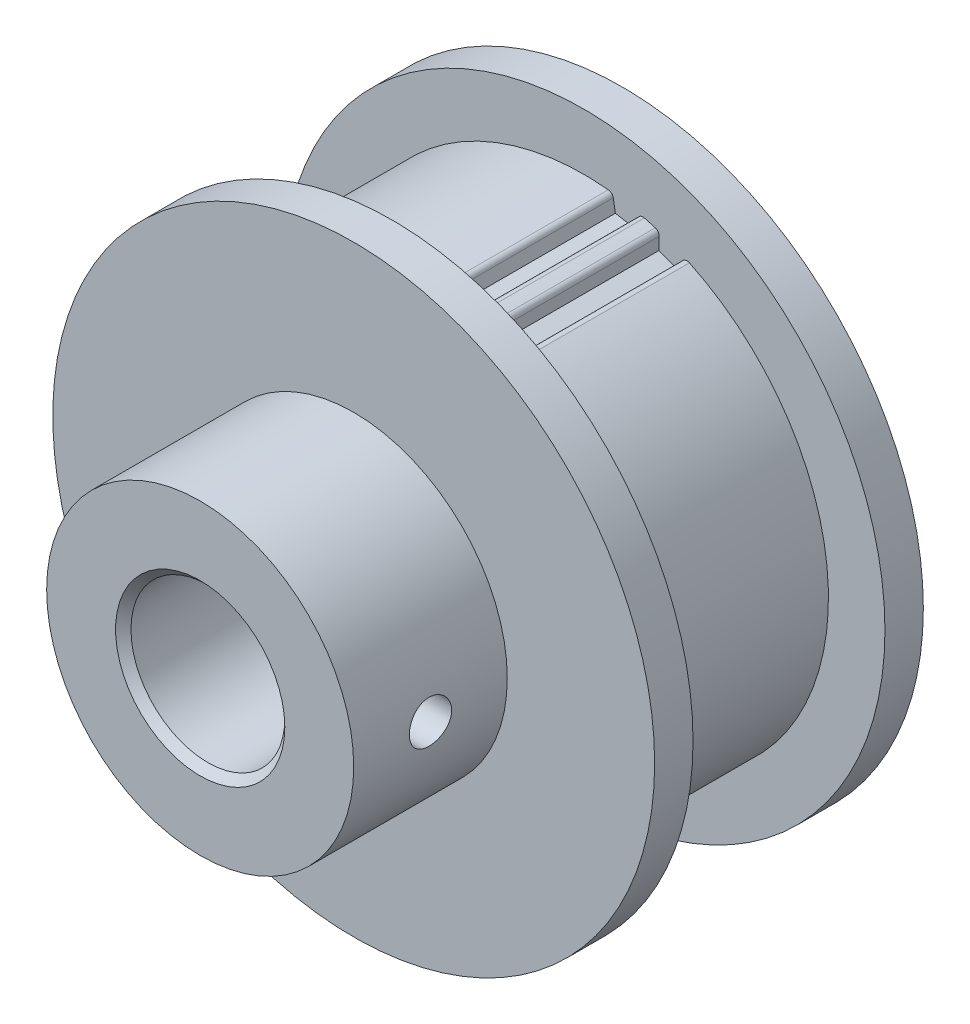
ISO-10303-21;
HEADER;
FILE_DESCRIPTION(('STEP AP214'),'2;1');
FILE_NAME('part.step','',(''),(''),'','','');
FILE_SCHEMA(('AUTOMOTIVE_DESIGN { 1 0 10303 214 1 1 1 1 }'));
ENDSEC;
DATA;
#1=APPLICATION_CONTEXT('core data for automotive mechanical design processes');
#2=APPLICATION_PROTOCOL_DEFINITION('international standard','automotive_design',2000,#1);
#3=PRODUCT_CONTEXT('',#1,'mechanical');
#4=PRODUCT('Part','Part','',(#3));
#5=PRODUCT_RELATED_PRODUCT_CATEGORY('part','',(#4));
#6=PRODUCT_DEFINITION_FORMATION('','',#4);
#7=PRODUCT_DEFINITION_CONTEXT('part definition',#1,'design');
#8=PRODUCT_DEFINITION('design','',#6,#7);
#9=PRODUCT_DEFINITION_SHAPE('','',#8);
#10=(LENGTH_UNIT() NAMED_UNIT(*) SI_UNIT(.MILLI.,.METRE.));
#11=(NAMED_UNIT(*) PLANE_ANGLE_UNIT() SI_UNIT($,.RADIAN.));
#12=(NAMED_UNIT(*) SI_UNIT($,.STERADIAN.) SOLID_ANGLE_UNIT());
#13=UNCERTAINTY_MEASURE_WITH_UNIT(LENGTH_MEASURE(1.E-05),#10,'distance_accuracy_value','');
#14=(GEOMETRIC_REPRESENTATION_CONTEXT(3) GLOBAL_UNCERTAINTY_ASSIGNED_CONTEXT((#13)) GLOBAL_UNIT_ASSIGNED_CONTEXT((#10,
#11,#12)) REPRESENTATION_CONTEXT('',''));
#15=CARTESIAN_POINT('',(0.,0.,0.));
#16=DIRECTION('',(0.,0.,1.));
#17=DIRECTION('',(1.,0.,0.));
#18=AXIS2_PLACEMENT_3D('',#15,#16,#17);
#19=CARTESIAN_POINT('',(0.,0.,11.9062499999245));
#20=DIRECTION('',(0.,0.,1.));
#21=DIRECTION('',(1.,0.,0.));
#22=AXIS2_PLACEMENT_3D('',#19,#20,#21);
#23=CONICAL_SURFACE('',#22,3.49948499996344,0.785398163486787);
#24=CARTESIAN_POINT('',(0.,0.,11.588115));
#25=DIRECTION('',(0.,0.,-1.));
#26=DIRECTION('',(-1.,0.,0.));
#27=AXIS2_PLACEMENT_3D('',#24,#25,#26);
#28=CIRCLE('',#27,3.18135);
#29=CARTESIAN_POINT('',(-3.18135,0.,11.588115));
#30=VERTEX_POINT('',#29);
#31=EDGE_CURVE('E105',#30,#30,#28,.T.);
#32=ORIENTED_EDGE('',*,*,#31,.T.);
#33=EDGE_LOOP('',(#32));
#34=FACE_BOUND('',#33,.T.);
#35=CARTESIAN_POINT('',(0.,0.,11.9062499999814));
#36=DIRECTION('',(0.,0.,1.));
#37=DIRECTION('',(1.,0.,0.));
#38=AXIS2_PLACEMENT_3D('',#35,#36,#37);
#39=CIRCLE('',#38,3.49948500002029);
#40=CARTESIAN_POINT('',(3.49948500002029,0.,11.9062499999814));
#41=VERTEX_POINT('',#40);
#42=EDGE_CURVE('E378',#41,#41,#39,.F.);
#43=ORIENTED_EDGE('',*,*,#42,.F.);
#44=EDGE_LOOP('',(#43));
#45=FACE_BOUND('',#44,.T.);
#46=ADVANCED_FACE('F16',(#34,#45),#23,.F.);
#47=CARTESIAN_POINT('',(0.,0.,-3.96875));
#48=DIRECTION('',(0.,0.,1.));
#49=DIRECTION('',(1.,0.,0.));
#50=AXIS2_PLACEMENT_3D('',#47,#48,#49);
#51=CYLINDRICAL_SURFACE('',#50,10.1092);
#52=CARTESIAN_POINT('',(0.,0.,3.96875));
#53=DIRECTION('',(0.,0.,1.));
#54=DIRECTION('',(1.,0.,0.));
#55=AXIS2_PLACEMENT_3D('',#52,#53,#54);
#56=CIRCLE('',#55,10.1092);
#57=CARTESIAN_POINT('',(2.49571585129707,9.7962914934953,3.96875));
#58=VERTEX_POINT('',#57);
#59=CARTESIAN_POINT('',(2.94843911176593,9.66967587012208,3.96875));
#60=VERTEX_POINT('',#59);
#61=EDGE_CURVE('E90',#58,#60,#56,.F.);
#62=ORIENTED_EDGE('',*,*,#61,.T.);
#63=DIRECTION('',(0.,0.,-1.));
#64=VECTOR('',#63,1.);
#65=CARTESIAN_POINT('',(2.94843911176593,9.66967587012208,-3.96875));
#66=LINE('',#65,#64);
#67=CARTESIAN_POINT('',(2.94843906606155,9.66967588434216,-3.96875));
#68=VERTEX_POINT('',#67);
#69=EDGE_CURVE('E93',#68,#60,#66,.F.);
#70=ORIENTED_EDGE('',*,*,#69,.F.);
#71=CARTESIAN_POINT('',(0.,0.,-3.96875));
#72=DIRECTION('',(0.,0.,1.));
#73=DIRECTION('',(1.,0.,0.));
#74=AXIS2_PLACEMENT_3D('',#71,#72,#73);
#75=CIRCLE('',#74,10.1092);
#76=CARTESIAN_POINT('',(2.49572910728155,9.79628811658046,-3.96875));
#77=VERTEX_POINT('',#76);
#78=EDGE_CURVE('E19',#68,#77,#75,.T.);
#79=ORIENTED_EDGE('',*,*,#78,.T.);
#80=CARTESIAN_POINT('',(2.49571585116245,9.79629149332258,3.96875));
#81=CARTESIAN_POINT('',(2.49571640350494,9.79629135264149,3.63802083333333));
#82=CARTESIAN_POINT('',(2.4957169558469,9.79629121195834,3.30729166666667));
#83=CARTESIAN_POINT('',(2.49571806052977,9.79629093058792,2.64583333333333));
#84=CARTESIAN_POINT('',(2.49571861287068,9.79629078990063,2.31510416666667));
#85=CARTESIAN_POINT('',(2.49571971755144,9.79629050852194,1.65364583333333));
#86=CARTESIAN_POINT('',(2.4957202698913,9.79629036783053,1.32291666666667));
#87=CARTESIAN_POINT('',(2.49572137456996,9.79629008644357,0.661458333333333));
#88=CARTESIAN_POINT('',(2.49572192690876,9.79628994574803,0.330729166666667));
#89=CARTESIAN_POINT('',(2.49572303158532,9.79628966435281,-0.330729166666667));
#90=CARTESIAN_POINT('',(2.49572358392307,9.79628952365314,-0.661458333333333));
#91=CARTESIAN_POINT('',(2.49572468859752,9.79628924224966,-1.32291666666667));
#92=CARTESIAN_POINT('',(2.49572524093421,9.79628910154585,-1.65364583333333));
#93=CARTESIAN_POINT('',(2.49572634560656,9.79628882013411,-2.31510416666667));
#94=CARTESIAN_POINT('',(2.49572689794221,9.79628867942617,-2.64583333333333));
#95=CARTESIAN_POINT('',(2.49572800261245,9.79628839800616,-3.30729166666667));
#96=CARTESIAN_POINT('',(2.49572855494704,9.79628825729409,-3.63802083333333));
#97=CARTESIAN_POINT('',(2.49572910728111,9.79628811657996,-3.96875));
#98=B_SPLINE_CURVE_WITH_KNOTS('',3,(#80,#81,#82,#83,#84,#85,#86,#87,#88,#89,#90,#91,#92,#93,#94,
#95,#96,#97),.UNSPECIFIED.,.F.,.F.,(4,2,2,2,2,2,2,2,4),(0.,0.992187500001473,1.98437500000295,
2.97656250000442,3.96875000000589,4.96093750000737,5.95312500000884,6.94531250001031,
7.93750000001179),.UNSPECIFIED.);
#99=EDGE_CURVE('E117',#58,#77,#98,.T.);
#100=ORIENTED_EDGE('',*,*,#99,.F.);
#101=EDGE_LOOP('',(#62,#70,#79,#100));
#102=FACE_BOUND('',#101,.T.);
#103=ADVANCED_FACE('F94',(#102),#51,.T.);
#104=CARTESIAN_POINT('',(0.,0.,11.90625));
#105=DIRECTION('',(0.,0.,1.));
#106=DIRECTION('',(1.,0.,0.));
#107=AXIS2_PLACEMENT_3D('',#104,#105,#106);
#108=PLANE('',#107);
#109=ORIENTED_EDGE('',*,*,#42,.T.);
#110=EDGE_LOOP('',(#109));
#111=FACE_BOUND('',#110,.T.);
#112=CARTESIAN_POINT('',(0.,0.,11.90625));
#113=DIRECTION('',(0.,0.,1.));
#114=DIRECTION('',(1.,0.,0.));
#115=AXIS2_PLACEMENT_3D('',#112,#113,#114);
#116=CIRCLE('',#115,6.35);
#117=CARTESIAN_POINT('',(6.35,0.,11.90625));
#118=VERTEX_POINT('',#117);
#119=EDGE_CURVE('E97',#118,#118,#116,.F.);
#120=ORIENTED_EDGE('',*,*,#119,.F.);
#121=EDGE_LOOP('',(#120));
#122=FACE_BOUND('',#121,.T.);
#123=ADVANCED_FACE('F383',(#111,#122),#108,.T.);
#124=CARTESIAN_POINT('',(6.35,0.,8.73125));
#125=DIRECTION('',(1.,0.,0.));
#126=DIRECTION('',(0.,0.,-1.));
#127=AXIS2_PLACEMENT_3D('',#124,#125,#126);
#128=CYLINDRICAL_SURFACE('',#127,0.8763);
#129=CARTESIAN_POINT('',(3.18135,0.,7.85495));
#130=CARTESIAN_POINT('',(3.18134841128343,-0.0481893943951872,7.85495254429007));
#131=CARTESIAN_POINT('',(3.18024298845227,-0.0964335547292547,7.85894291922159));
#132=CARTESIAN_POINT('',(3.1759353654732,-0.191573484811042,7.87478331663995));
#133=CARTESIAN_POINT('',(3.17272934101652,-0.238466632063338,7.886647674836));
#134=CARTESIAN_POINT('',(3.16457466220837,-0.329449970853952,7.91781809631712));
#135=CARTESIAN_POINT('',(3.15962928961197,-0.373545257646135,7.93711015166962));
#136=CARTESIAN_POINT('',(3.14851760225123,-0.457859625360473,7.98254420470743));
#137=CARTESIAN_POINT('',(3.14235155403727,-0.498079549672782,8.00868470734763));
#138=CARTESIAN_POINT('',(3.12929072619131,-0.574513195352826,8.06775877064851));
#139=CARTESIAN_POINT('',(3.12238278346796,-0.61061784951194,8.1008305529729));
#140=CARTESIAN_POINT('',(3.1086994626396,-0.676846842823859,8.17253470856861));
#141=CARTESIAN_POINT('',(3.10192411036523,-0.706970026947473,8.21116815332408));
#142=CARTESIAN_POINT('',(3.08913865023835,-0.760917411740671,8.29377557553412));
#143=CARTESIAN_POINT('',(3.08314497886407,-0.784615059156057,8.33783497873882));
#144=CARTESIAN_POINT('',(3.07279466027877,-0.824222549668575,8.42950438590107));
#145=CARTESIAN_POINT('',(3.06843767702725,-0.840133991612145,8.47711365860032));
#146=CARTESIAN_POINT('',(3.06198946318021,-0.86333728324876,8.57332587965073));
#147=CARTESIAN_POINT('',(3.05984641038301,-0.870826661539665,8.62187763053884));
#148=CARTESIAN_POINT('',(3.05791403428716,-0.877589320778472,8.71959215350185));
#149=CARTESIAN_POINT('',(3.05812424135696,-0.876864241055676,8.76875480170605));
#150=CARTESIAN_POINT('',(3.06082836184337,-0.86737498103517,8.86473753553722));
#151=CARTESIAN_POINT('',(3.06325376749431,-0.85885194837192,8.91158370224317));
#152=CARTESIAN_POINT('',(3.07000504534929,-0.834395708839866,9.00315421241168));
#153=CARTESIAN_POINT('',(3.07433108991607,-0.818461829897933,9.04787836302787));
#154=CARTESIAN_POINT('',(3.08445515923665,-0.779444059813929,9.13455486799616));
#155=CARTESIAN_POINT('',(3.09027014540672,-0.756277055716914,9.17646774346375));
#156=CARTESIAN_POINT('',(3.10270754980193,-0.703510106023451,9.25589214469865));
#157=CARTESIAN_POINT('',(3.10933008550084,-0.673909224003207,9.29340302854957));
#158=CARTESIAN_POINT('',(3.12291891433506,-0.607896089575789,9.36433109630335));
#159=CARTESIAN_POINT('',(3.12988915724795,-0.571282941371303,9.39756080407239));
#160=CARTESIAN_POINT('',(3.14318526025427,-0.492901554098854,9.45746141098996));
#161=CARTESIAN_POINT('',(3.1495108435139,-0.451131117240939,9.48412949930078));
#162=CARTESIAN_POINT('',(3.1608491773403,-0.363305959994821,9.53024004910479));
#163=CARTESIAN_POINT('',(3.16585434053572,-0.317228455148669,9.54964100882948));
#164=CARTESIAN_POINT('',(3.1739253063138,-0.222350425059078,9.58033055719853));
#165=CARTESIAN_POINT('',(3.17699512787984,-0.173555773330067,9.59163596397015));
#166=CARTESIAN_POINT('',(3.17972928272051,-0.103619486643986,9.60165092825382));
#167=CARTESIAN_POINT('',(3.18033546992572,-0.082965325340154,9.60386078577132));
#168=CARTESIAN_POINT('',(3.18114617161247,-0.0415441698215397,9.60681087216581));
#169=CARTESIAN_POINT('',(3.18135068498563,-0.0207771752955611,9.60755109698746));
#170=CARTESIAN_POINT('',(3.18134841128344,0.0481893943951852,9.60754745570995));
#171=CARTESIAN_POINT('',(3.18024298845228,0.0964335547292525,9.60355708077842));
#172=CARTESIAN_POINT('',(3.1759353654732,0.19157348481104,9.58771668336004));
#173=CARTESIAN_POINT('',(3.17272934101652,0.238466632063337,9.57585232516399));
#174=CARTESIAN_POINT('',(3.16457466220837,0.329449970853952,9.54468190368288));
#175=CARTESIAN_POINT('',(3.15962928961197,0.373545257646137,9.52538984833038));
#176=CARTESIAN_POINT('',(3.14851760225123,0.457859625360475,9.47995579529257));
#177=CARTESIAN_POINT('',(3.14235155403726,0.498079549672783,9.45381529265236));
#178=CARTESIAN_POINT('',(3.12929072619131,0.574513195352827,9.39474122935149));
#179=CARTESIAN_POINT('',(3.12238278346796,0.610617849511941,9.3616694470271));
#180=CARTESIAN_POINT('',(3.1086994626396,0.676846842823859,9.28996529143139));
#181=CARTESIAN_POINT('',(3.10192411036523,0.706970026947474,9.25133184667592));
#182=CARTESIAN_POINT('',(3.08913865023835,0.760917411740671,9.16872442446587));
#183=CARTESIAN_POINT('',(3.08314497886407,0.784615059156057,9.12466502126118));
#184=CARTESIAN_POINT('',(3.07279466027877,0.824222549668575,9.03299561409893));
#185=CARTESIAN_POINT('',(3.06843767702726,0.840133991612145,8.98538634139967));
#186=CARTESIAN_POINT('',(3.06198946318021,0.86333728324876,8.88917412034927));
#187=CARTESIAN_POINT('',(3.05984641038301,0.870826661539664,8.84062236946116));
#188=CARTESIAN_POINT('',(3.05791403428716,0.877589320778472,8.74290784649815));
#189=CARTESIAN_POINT('',(3.05812424135696,0.876864241055676,8.69374519829395));
#190=CARTESIAN_POINT('',(3.06082836184337,0.86737498103517,8.59776246446278));
#191=CARTESIAN_POINT('',(3.06325376749431,0.85885194837192,8.55091629775683));
#192=CARTESIAN_POINT('',(3.07000504534929,0.834395708839866,8.45934578758832));
#193=CARTESIAN_POINT('',(3.07433108991607,0.818461829897932,8.41462163697213));
#194=CARTESIAN_POINT('',(3.08445515923665,0.779444059813928,8.32794513200383));
#195=CARTESIAN_POINT('',(3.09027014540672,0.756277055716914,8.28603225653625));
#196=CARTESIAN_POINT('',(3.10270754980193,0.70351010602345,8.20660785530134));
#197=CARTESIAN_POINT('',(3.10933008550084,0.673909224003205,8.16909697145043));
#198=CARTESIAN_POINT('',(3.12291891433506,0.607896089575788,8.09816890369665));
#199=CARTESIAN_POINT('',(3.12988915724795,0.571282941371302,8.06493919592761));
#200=CARTESIAN_POINT('',(3.14318526025427,0.492901554098853,8.00503858901004));
#201=CARTESIAN_POINT('',(3.1495108435139,0.451131117240938,7.97837050069922));
#202=CARTESIAN_POINT('',(3.1608491773403,0.36330595999482,7.93225995089521));
#203=CARTESIAN_POINT('',(3.16585434053572,0.317228455148667,7.91285899117052));
#204=CARTESIAN_POINT('',(3.1739253063138,0.222350425059076,7.88216944280147));
#205=CARTESIAN_POINT('',(3.17699512787984,0.173555773330065,7.87086403602985));
#206=CARTESIAN_POINT('',(3.17972928272051,0.103619486643985,7.86084907174617));
#207=CARTESIAN_POINT('',(3.18033546992572,0.0829653253401535,7.85863921422867));
#208=CARTESIAN_POINT('',(3.18114617161247,0.0415441698215389,7.85568912783419));
#209=CARTESIAN_POINT('',(3.18135068498563,0.0207771752955599,7.85494890301255));
#210=CARTESIAN_POINT('',(3.18135,0.,7.85495));
#211=B_SPLINE_CURVE_WITH_KNOTS('',3,(#129,#130,#131,#132,#133,#134,#135,#136,#137,#138,#139,
#140,#141,#142,#143,#144,#145,#146,#147,#148,#149,#150,#151,#152,#153,#154,#155,#156,#157,#158,
#159,#160,#161,#162,#163,#164,#165,#166,#167,#168,#169,#170,#171,#172,#173,#174,#175,#176,#177,
#178,#179,#180,#181,#182,#183,#184,#185,#186,#187,#188,#189,#190,#191,#192,#193,#194,#195,#196,
#197,#198,#199,#200,#201,#202,#203,#204,#205,#206,#207,#208,#209,#210),.UNSPECIFIED.,.T.,.F.,(4,
2,2,2,2,2,2,2,2,2,2,2,2,2,2,2,2,2,2,2,2,2,2,2,2,2,2,2,2,2,2,2,2,2,2,2,2,2,2,2,4),(0.,
0.144488377736948,0.289240541482826,0.433721043074943,0.578170030204596,0.725833451323394,
0.873525358759691,1.02394383604916,1.17433141291198,1.32111306899122,1.46786543290902,
1.61022753532876,1.75260255076833,1.8966778057285,2.04077404429288,2.18987597815134,
2.33904167287127,2.48904669860112,2.63873918472978,2.7010361300674,2.76333324730844,
2.90782162504539,3.05257378879127,3.19705429038339,3.34150327751304,3.48916669863184,
3.63685860606813,3.78727708335761,3.93766466022042,4.08444631629966,4.23119868021747,
4.3735607826372,4.51593579807677,4.66001105303695,4.80410729160133,4.95320922545979,
5.10237492017971,5.25237994590956,5.40207243203823,5.46436937737585,5.52666649461689),.UNSPECIFIED.);
#212=CARTESIAN_POINT('',(3.18135,0.,7.85495));
#213=VERTEX_POINT('',#212);
#214=EDGE_CURVE('E110',#213,#213,#211,.T.);
#215=ORIENTED_EDGE('',*,*,#214,.T.);
#216=EDGE_LOOP('',(#215));
#217=FACE_BOUND('',#216,.T.);
#218=CARTESIAN_POINT('',(6.35,0.,9.60755));
#219=CARTESIAN_POINT('',(6.34999882187669,0.0489415771597092,9.60754616320811));
#220=CARTESIAN_POINT('',(6.34942800821972,0.0979213332346681,9.60343477331248));
#221=CARTESIAN_POINT('',(6.34720354966283,0.194563062898023,9.58708711980179));
#222=CARTESIAN_POINT('',(6.34554766851812,0.242222102701271,9.57483407610127));
#223=CARTESIAN_POINT('',(6.34133982788259,0.334740336646979,9.54257411145077));
#224=CARTESIAN_POINT('',(6.33878887138616,0.379602598779894,9.52257586694625));
#225=CARTESIAN_POINT('',(6.33307420782727,0.465315207568056,9.47541124154906));
#226=CARTESIAN_POINT('',(6.32991074815052,0.506167163952205,9.44824775304814));
#227=CARTESIAN_POINT('',(6.32329924345527,0.582996272424449,9.38732538917262));
#228=CARTESIAN_POINT('',(6.31984959320628,0.618942452363305,9.35352762428492));
#229=CARTESIAN_POINT('',(6.31306712422079,0.684673754170098,9.28037817479168));
#230=CARTESIAN_POINT('',(6.3097343177217,0.714458232295754,9.24102591060299));
#231=CARTESIAN_POINT('',(6.3035477527944,0.767133966387388,9.15768525998461));
#232=CARTESIAN_POINT('',(6.30069602295117,0.789996340177399,9.11367845489106));
#233=CARTESIAN_POINT('',(6.29581567258008,0.82799411313821,9.02240424456906));
#234=CARTESIAN_POINT('',(6.29378700692697,0.843129935936009,8.97513701826248));
#235=CARTESIAN_POINT('',(6.2907977696625,0.865151653714141,8.87900167927929));
#236=CARTESIAN_POINT('',(6.2898304942145,0.872089350471169,8.83014564500724));
#237=CARTESIAN_POINT('',(6.28905313306064,0.877678261954059,8.73195386567757));
#238=CARTESIAN_POINT('',(6.28924299293673,0.876329866360268,8.68261814328778));
#239=CARTESIAN_POINT('',(6.29075231412336,0.865427317998414,8.58523143751886));
#240=CARTESIAN_POINT('',(6.29206386687331,0.855930613835058,8.53717388259181));
#241=CARTESIAN_POINT('',(6.29565646998516,0.829090669134637,8.44334060315377));
#242=CARTESIAN_POINT('',(6.29793755226146,0.811747170300142,8.39756495381265));
#243=CARTESIAN_POINT('',(6.30322113786918,0.769644512986987,8.30941725547737));
#244=CARTESIAN_POINT('',(6.30622605628008,0.744860459430527,8.26705724800358));
#245=CARTESIAN_POINT('',(6.31261662239552,0.688600197305214,8.18707907475268));
#246=CARTESIAN_POINT('',(6.31600226089223,0.657124150567819,8.14946079434215));
#247=CARTESIAN_POINT('',(6.32280742533891,0.588062483295033,8.0797034161643));
#248=CARTESIAN_POINT('',(6.32622700021573,0.550428547876647,8.04761214014584));
#249=CARTESIAN_POINT('',(6.33269028078134,0.470263996513727,7.99017964767082));
#250=CARTESIAN_POINT('',(6.33573381522638,0.427731166589357,7.96484150046508));
#251=CARTESIAN_POINT('',(6.34110506828362,0.338921247244961,7.92163475503292));
#252=CARTESIAN_POINT('',(6.34343187613631,0.292639487477982,7.9037756503118));
#253=CARTESIAN_POINT('',(6.34709601387838,0.197770461568279,7.87613560941537));
#254=CARTESIAN_POINT('',(6.34843543534113,0.149188302186464,7.86633759235411));
#255=CARTESIAN_POINT('',(6.3497352523519,0.0669155657182631,7.85686542506523));
#256=CARTESIAN_POINT('',(6.35000080561176,0.0334667089989035,7.85494737636576));
#257=CARTESIAN_POINT('',(6.34999882187669,-0.0489415771597097,7.85495383679188));
#258=CARTESIAN_POINT('',(6.34942800821972,-0.0979213332346686,7.85906522668752));
#259=CARTESIAN_POINT('',(6.34720354966283,-0.194563062898024,7.87541288019821));
#260=CARTESIAN_POINT('',(6.34554766851812,-0.242222102701271,7.88766592389873));
#261=CARTESIAN_POINT('',(6.34133982788259,-0.33474033664698,7.91992588854923));
#262=CARTESIAN_POINT('',(6.33878887138616,-0.379602598779895,7.93992413305375));
#263=CARTESIAN_POINT('',(6.33307420782727,-0.465315207568056,7.98708875845094));
#264=CARTESIAN_POINT('',(6.32991074815052,-0.506167163952205,8.01425224695186));
#265=CARTESIAN_POINT('',(6.32329924345527,-0.58299627242445,8.07517461082737));
#266=CARTESIAN_POINT('',(6.31984959320628,-0.618942452363306,8.10897237571508));
#267=CARTESIAN_POINT('',(6.31306712422079,-0.684673754170099,8.18212182520832));
#268=CARTESIAN_POINT('',(6.3097343177217,-0.714458232295755,8.22147408939701));
#269=CARTESIAN_POINT('',(6.3035477527944,-0.767133966387389,8.30481474001539));
#270=CARTESIAN_POINT('',(6.30069602295117,-0.7899963401774,8.34882154510894));
#271=CARTESIAN_POINT('',(6.29581567258008,-0.827994113138211,8.44009575543095));
#272=CARTESIAN_POINT('',(6.29378700692697,-0.84312993593601,8.48736298173752));
#273=CARTESIAN_POINT('',(6.2907977696625,-0.865151653714142,8.58349832072071));
#274=CARTESIAN_POINT('',(6.2898304942145,-0.872089350471169,8.63235435499276));
#275=CARTESIAN_POINT('',(6.28905313306064,-0.877678261954059,8.73054613432243));
#276=CARTESIAN_POINT('',(6.28924299293673,-0.876329866360268,8.77988185671222));
#277=CARTESIAN_POINT('',(6.29075231412336,-0.865427317998414,8.87726856248114));
#278=CARTESIAN_POINT('',(6.29206386687331,-0.855930613835058,8.9253261174082));
#279=CARTESIAN_POINT('',(6.29565646998516,-0.829090669134636,9.01915939684623));
#280=CARTESIAN_POINT('',(6.29793755226146,-0.811747170300141,9.06493504618735));
#281=CARTESIAN_POINT('',(6.30322113786918,-0.769644512986986,9.15308274452263));
#282=CARTESIAN_POINT('',(6.30622605628008,-0.744860459430526,9.19544275199642));
#283=CARTESIAN_POINT('',(6.31261662239552,-0.688600197305213,9.27542092524732));
#284=CARTESIAN_POINT('',(6.31600226089223,-0.657124150567818,9.31303920565785));
#285=CARTESIAN_POINT('',(6.32280742533891,-0.588062483295033,9.3827965838357));
#286=CARTESIAN_POINT('',(6.32622700021573,-0.550428547876646,9.41488785985415));
#287=CARTESIAN_POINT('',(6.33269028078134,-0.470263996513726,9.47232035232918));
#288=CARTESIAN_POINT('',(6.33573381522638,-0.427731166589355,9.49765849953491));
#289=CARTESIAN_POINT('',(6.34110506828362,-0.338921247244959,9.54086524496708));
#290=CARTESIAN_POINT('',(6.34343187613631,-0.29263948747798,9.5587243496882));
#291=CARTESIAN_POINT('',(6.34709601387838,-0.197770461568278,9.58636439058463));
#292=CARTESIAN_POINT('',(6.34843543534113,-0.149188302186463,9.59616240764589));
#293=CARTESIAN_POINT('',(6.3497352523519,-0.0669155657182629,9.60563457493477));
#294=CARTESIAN_POINT('',(6.35000080561176,-0.0334667089989036,9.60755262363424));
#295=CARTESIAN_POINT('',(6.35,0.,9.60755));
#296=B_SPLINE_CURVE_WITH_KNOTS('',3,(#218,#219,#220,#221,#222,#223,#224,#225,#226,#227,#228,
#229,#230,#231,#232,#233,#234,#235,#236,#237,#238,#239,#240,#241,#242,#243,#244,#245,#246,#247,
#248,#249,#250,#251,#252,#253,#254,#255,#256,#257,#258,#259,#260,#261,#262,#263,#264,#265,#266,
#267,#268,#269,#270,#271,#272,#273,#274,#275,#276,#277,#278,#279,#280,#281,#282,#283,#284,#285,
#286,#287,#288,#289,#290,#291,#292,#293,#294,#295),.UNSPECIFIED.,.T.,.F.,(4,2,2,2,2,2,2,2,2,2,2,
2,2,2,2,2,2,2,2,2,2,2,2,2,2,2,2,2,2,2,2,2,2,2,2,2,2,2,4),(0.,0.146716851837857,
0.293737031419066,0.440592988012612,0.58738975378788,0.735074210720014,0.882774089166177,
1.03108200544478,1.17938178950668,1.32673940891228,1.47409009840129,1.62041036800368,
1.76673545446456,1.91355568685095,2.06037236910965,2.20840168725813,2.35649816943142,
2.50478207187605,2.65275095584434,2.75307731373161,2.89979416556947,3.04681434515068,
3.19367030174423,3.34046706751949,3.48815152445163,3.63585140289779,3.7841593191764,
3.9324591032383,4.07981672264389,4.2271674121329,4.37348768173529,4.51981276819618,
4.66663300058257,4.81344968284126,4.96147900098974,5.10957548316304,5.25785938560767,
5.40582826957595,5.50615462746323),.UNSPECIFIED.);
#297=CARTESIAN_POINT('',(6.35,0.,9.60755));
#298=VERTEX_POINT('',#297);
#299=EDGE_CURVE('E188',#298,#298,#296,.T.);
#300=ORIENTED_EDGE('',*,*,#299,.F.);
#301=EDGE_LOOP('',(#300));
#302=FACE_BOUND('',#301,.T.);
#303=ADVANCED_FACE('F120',(#217,#302),#128,.F.);
#304=CARTESIAN_POINT('',(2.43929302194116,9.57476401344104,-3.96875));
#305=DIRECTION('',(0.,0.,-1.));
#306=DIRECTION('',(-1.,0.,0.));
#307=AXIS2_PLACEMENT_3D('',#304,#305,#306);
#308=CYLINDRICAL_SURFACE('',#307,0.2286);
#309=CARTESIAN_POINT('',(2.43929302194116,9.57476401344104,3.96875));
#310=DIRECTION('',(0.,0.,-1.));
#311=DIRECTION('',(-1.,0.,0.));
#312=AXIS2_PLACEMENT_3D('',#309,#310,#311);
#313=CIRCLE('',#312,0.2286);
#314=CARTESIAN_POINT('',(2.24131961463603,9.68906401344104,3.96875));
#315=VERTEX_POINT('',#314);
#316=EDGE_CURVE('E118',#315,#58,#313,.T.);
#317=ORIENTED_EDGE('',*,*,#316,.T.);
#318=ORIENTED_EDGE('',*,*,#99,.T.);
#319=CARTESIAN_POINT('',(2.43929302194116,9.57476401344104,-3.96875));
#320=DIRECTION('',(0.,0.,-1.));
#321=DIRECTION('',(-1.,0.,0.));
#322=AXIS2_PLACEMENT_3D('',#319,#320,#321);
#323=CIRCLE('',#322,0.2286);
#324=CARTESIAN_POINT('',(2.24131961463603,9.68906401344104,-3.96875));
#325=VERTEX_POINT('',#324);
#326=EDGE_CURVE('E86',#77,#325,#323,.F.);
#327=ORIENTED_EDGE('',*,*,#326,.T.);
#328=DIRECTION('',(0.,0.,1.));
#329=VECTOR('',#328,1.);
#330=CARTESIAN_POINT('',(2.24131961463603,9.68906401344104,-3.96875));
#331=LINE('',#330,#329);
#332=EDGE_CURVE('E334',#325,#315,#331,.T.);
#333=ORIENTED_EDGE('',*,*,#332,.T.);
#334=EDGE_LOOP('',(#317,#318,#327,#333));
#335=FACE_BOUND('',#334,.T.);
#336=ADVANCED_FACE('F128',(#335),#308,.T.);
#337=CARTESIAN_POINT('',(0.,0.,11.90625));
#338=DIRECTION('',(0.,0.,-1.));
#339=DIRECTION('',(-1.,0.,0.));
#340=AXIS2_PLACEMENT_3D('',#337,#338,#339);
#341=CYLINDRICAL_SURFACE('',#340,3.18135);
#342=ORIENTED_EDGE('',*,*,#31,.F.);
#343=EDGE_LOOP('',(#342));
#344=FACE_BOUND('',#343,.T.);
#345=CARTESIAN_POINT('',(0.,0.,-5.23811499999738));
#346=DIRECTION('',(0.,0.,-1.));
#347=DIRECTION('',(-1.,0.,0.));
#348=AXIS2_PLACEMENT_3D('',#345,#346,#347);
#349=CIRCLE('',#348,3.1813499999771);
#350=CARTESIAN_POINT('',(-3.1813499999771,0.,-5.23811499999738));
#351=VERTEX_POINT('',#350);
#352=EDGE_CURVE('E324',#351,#351,#349,.T.);
#353=ORIENTED_EDGE('',*,*,#352,.T.);
#354=EDGE_LOOP('',(#353));
#355=FACE_BOUND('',#354,.T.);
#356=ORIENTED_EDGE('',*,*,#214,.F.);
#357=EDGE_LOOP('',(#356));
#358=FACE_BOUND('',#357,.T.);
#359=ADVANCED_FACE('F124',(#344,#355,#358),#341,.F.);
#360=CARTESIAN_POINT('',(2.8817509628645,9.4510194025843,-3.96875));
#361=DIRECTION('',(0.,0.,-1.));
#362=DIRECTION('',(-1.,0.,0.));
#363=AXIS2_PLACEMENT_3D('',#360,#361,#362);
#364=CYLINDRICAL_SURFACE('',#363,0.2286);
#365=CARTESIAN_POINT('',(2.8817509628645,9.4510194025843,-3.96875));
#366=DIRECTION('',(0.,0.,-1.));
#367=DIRECTION('',(-1.,0.,0.));
#368=AXIS2_PLACEMENT_3D('',#365,#366,#367);
#369=CIRCLE('',#368,0.2286);
#370=CARTESIAN_POINT('',(3.110296562255,9.44603251986553,-3.96875));
#371=VERTEX_POINT('',#370);
#372=EDGE_CURVE('E83',#371,#68,#369,.F.);
#373=ORIENTED_EDGE('',*,*,#372,.T.);
#374=ORIENTED_EDGE('',*,*,#69,.T.);
#375=CARTESIAN_POINT('',(2.8817509628645,9.4510194025843,3.96875));
#376=DIRECTION('',(0.,0.,-1.));
#377=DIRECTION('',(-1.,0.,0.));
#378=AXIS2_PLACEMENT_3D('',#375,#376,#377);
#379=CIRCLE('',#378,0.2286);
#380=CARTESIAN_POINT('',(3.110296562255,9.44603251986553,3.96875));
#381=VERTEX_POINT('',#380);
#382=EDGE_CURVE('E103',#60,#381,#379,.T.);
#383=ORIENTED_EDGE('',*,*,#382,.T.);
#384=DIRECTION('',(0.,0.,1.));
#385=VECTOR('',#384,1.);
#386=CARTESIAN_POINT('',(3.110296562255,9.44603251986567,-3.96875));
#387=LINE('',#386,#385);
#388=EDGE_CURVE('E101',#381,#371,#387,.F.);
#389=ORIENTED_EDGE('',*,*,#388,.T.);
#390=EDGE_LOOP('',(#373,#374,#383,#389));
#391=FACE_BOUND('',#390,.T.);
#392=ADVANCED_FACE('F99',(#391),#364,.T.);
#393=CARTESIAN_POINT('',(0.,0.,5.55625));
#394=DIRECTION('',(0.,0.,1.));
#395=DIRECTION('',(1.,0.,0.));
#396=AXIS2_PLACEMENT_3D('',#393,#394,#395);
#397=CYLINDRICAL_SURFACE('',#396,6.35);
#398=CARTESIAN_POINT('',(0.,0.,5.55625));
#399=DIRECTION('',(0.,0.,1.));
#400=DIRECTION('',(1.,0.,0.));
#401=AXIS2_PLACEMENT_3D('',#398,#399,#400);
#402=CIRCLE('',#401,6.35);
#403=CARTESIAN_POINT('',(6.35,0.,5.55625));
#404=VERTEX_POINT('',#403);
#405=EDGE_CURVE('E185',#404,#404,#402,.F.);
#406=ORIENTED_EDGE('',*,*,#405,.F.);
#407=EDGE_LOOP('',(#406));
#408=FACE_BOUND('',#407,.T.);
#409=ORIENTED_EDGE('',*,*,#119,.T.);
#410=EDGE_LOOP('',(#409));
#411=FACE_BOUND('',#410,.T.);
#412=ORIENTED_EDGE('',*,*,#299,.T.);
#413=EDGE_LOOP('',(#412));
#414=FACE_BOUND('',#413,.T.);
#415=ADVANCED_FACE('F193',(#408,#411,#414),#397,.T.);
#416=CARTESIAN_POINT('',(2.24131961463603,9.68906401344104,-3.96875));
#417=DIRECTION('',(0.866025403784429,-0.500000000000017,0.));
#418=DIRECTION('',(0.500000000000017,0.866025403784429,0.));
#419=AXIS2_PLACEMENT_3D('',#416,#417,#418);
#420=PLANE('',#419);
#421=DIRECTION('',(0.500000000000017,0.866025403784429,0.));
#422=VECTOR('',#421,1.);
#423=CARTESIAN_POINT('',(2.24131961463603,9.68906401344104,3.96875));
#424=LINE('',#423,#422);
#425=CARTESIAN_POINT('',(1.98471100887901,9.24460487061098,3.96875));
#426=VERTEX_POINT('',#425);
#427=EDGE_CURVE('E331',#315,#426,#424,.F.);
#428=ORIENTED_EDGE('',*,*,#427,.F.);
#429=ORIENTED_EDGE('',*,*,#332,.F.);
#430=DIRECTION('',(0.500000000000017,0.866025403784429,0.));
#431=VECTOR('',#430,1.);
#432=CARTESIAN_POINT('',(2.24131961463603,9.68906401344104,-3.96875));
#433=LINE('',#432,#431);
#434=CARTESIAN_POINT('',(1.98471100887901,9.24460487061098,-3.96875));
#435=VERTEX_POINT('',#434);
#436=EDGE_CURVE('E192',#435,#325,#433,.T.);
#437=ORIENTED_EDGE('',*,*,#436,.F.);
#438=DIRECTION('',(0.,0.,1.));
#439=VECTOR('',#438,1.);
#440=CARTESIAN_POINT('',(1.98471100887891,9.24460487061104,-3.96875));
#441=LINE('',#440,#439);
#442=EDGE_CURVE('E307',#435,#426,#441,.T.);
#443=ORIENTED_EDGE('',*,*,#442,.T.);
#444=EDGE_LOOP('',(#428,#429,#437,#443));
#445=FACE_BOUND('',#444,.T.);
#446=ADVANCED_FACE('F197',(#445),#420,.F.);
#447=CARTESIAN_POINT('',(0.,0.,-5.55624999998372));
#448=DIRECTION('',(0.,0.,-1.));
#449=DIRECTION('',(-1.,0.,0.));
#450=AXIS2_PLACEMENT_3D('',#447,#448,#449);
#451=CONICAL_SURFACE('',#450,3.49948499996344,0.785398163397448);
#452=ORIENTED_EDGE('',*,*,#352,.F.);
#453=EDGE_LOOP('',(#452));
#454=FACE_BOUND('',#453,.T.);
#455=CARTESIAN_POINT('',(0.,0.,-5.55624999998372));
#456=DIRECTION('',(0.,0.,-1.));
#457=DIRECTION('',(-1.,0.,0.));
#458=AXIS2_PLACEMENT_3D('',#455,#456,#457);
#459=CIRCLE('',#458,3.49948499996344);
#460=CARTESIAN_POINT('',(-3.49948499996344,0.,-5.55624999998372));
#461=VERTEX_POINT('',#460);
#462=EDGE_CURVE('E180',#461,#461,#459,.T.);
#463=ORIENTED_EDGE('',*,*,#462,.T.);
#464=EDGE_LOOP('',(#463));
#465=FACE_BOUND('',#464,.T.);
#466=ADVANCED_FACE('F201',(#454,#465),#451,.F.);
#467=CARTESIAN_POINT('',(3.09910078778806,8.93293744014984,-3.96875));
#468=DIRECTION('',(-0.999762027079909,0.0218148850345602,0.));
#469=DIRECTION('',(-0.0218148850345602,-0.999762027079909,0.));
#470=AXIS2_PLACEMENT_3D('',#467,#468,#469);
#471=PLANE('',#470);
#472=DIRECTION('',(-0.0218148850345602,-0.999762027079909,0.));
#473=VECTOR('',#472,1.);
#474=CARTESIAN_POINT('',(3.09910078778806,8.93293744014984,3.96875));
#475=LINE('',#474,#473);
#476=CARTESIAN_POINT('',(3.09910078778812,8.93293744015004,3.96875));
#477=VERTEX_POINT('',#476);
#478=EDGE_CURVE('E314',#477,#381,#475,.F.);
#479=ORIENTED_EDGE('',*,*,#478,.F.);
#480=DIRECTION('',(0.,0.,1.));
#481=VECTOR('',#480,1.);
#482=CARTESIAN_POINT('',(3.09910078778815,8.93293744015008,-3.96875));
#483=LINE('',#482,#481);
#484=CARTESIAN_POINT('',(3.09910078778812,8.93293744015005,-3.96875));
#485=VERTEX_POINT('',#484);
#486=EDGE_CURVE('E179',#477,#485,#483,.F.);
#487=ORIENTED_EDGE('',*,*,#486,.T.);
#488=DIRECTION('',(-0.0218148850345602,-0.999762027079909,0.));
#489=VECTOR('',#488,1.);
#490=CARTESIAN_POINT('',(3.09910078778806,8.93293744014984,-3.96875));
#491=LINE('',#490,#489);
#492=EDGE_CURVE('E316',#371,#485,#491,.T.);
#493=ORIENTED_EDGE('',*,*,#492,.F.);
#494=ORIENTED_EDGE('',*,*,#388,.F.);
#495=EDGE_LOOP('',(#479,#487,#493,#494));
#496=FACE_BOUND('',#495,.T.);
#497=ADVANCED_FACE('F205',(#496),#471,.F.);
#498=CARTESIAN_POINT('',(0.,0.,5.55625));
#499=DIRECTION('',(0.,0.,1.));
#500=DIRECTION('',(1.,0.,0.));
#501=AXIS2_PLACEMENT_3D('',#498,#499,#500);
#502=PLANE('',#501);
#503=ORIENTED_EDGE('',*,*,#405,.T.);
#504=EDGE_LOOP('',(#503));
#505=FACE_BOUND('',#504,.T.);
#506=CARTESIAN_POINT('',(0.,0.,5.55625));
#507=DIRECTION('',(0.,0.,1.));
#508=DIRECTION('',(1.,0.,0.));
#509=AXIS2_PLACEMENT_3D('',#506,#507,#508);
#510=CIRCLE('',#509,12.446);
#511=CARTESIAN_POINT('',(12.446,0.,5.55625));
#512=VERTEX_POINT('',#511);
#513=EDGE_CURVE('E175',#512,#512,#510,.F.);
#514=ORIENTED_EDGE('',*,*,#513,.F.);
#515=EDGE_LOOP('',(#514));
#516=FACE_BOUND('',#515,.T.);
#517=ADVANCED_FACE('F209',(#505,#516),#502,.T.);
#518=CARTESIAN_POINT('',(1.98471100887891,9.24460487061104,-3.96875));
#519=DIRECTION('',(-0.173648177666902,-0.984807753012213,0.));
#520=DIRECTION('',(0.984807753012213,-0.173648177666902,0.));
#521=AXIS2_PLACEMENT_3D('',#518,#519,#520);
#522=PLANE('',#521);
#523=DIRECTION('',(0.984807753012213,-0.173648177666902,0.));
#524=VECTOR('',#523,1.);
#525=CARTESIAN_POINT('',(1.98471100887891,9.24460487061104,3.96875));
#526=LINE('',#525,#524);
#527=CARTESIAN_POINT('',(1.29682279339969,9.36589812271241,3.96875));
#528=VERTEX_POINT('',#527);
#529=EDGE_CURVE('E184',#426,#528,#526,.F.);
#530=ORIENTED_EDGE('',*,*,#529,.F.);
#531=ORIENTED_EDGE('',*,*,#442,.F.);
#532=DIRECTION('',(0.984807753012213,-0.173648177666902,0.));
#533=VECTOR('',#532,1.);
#534=CARTESIAN_POINT('',(1.98471100887891,9.24460487061104,-3.96875));
#535=LINE('',#534,#533);
#536=CARTESIAN_POINT('',(1.29682279339969,9.36589812271241,-3.96875));
#537=VERTEX_POINT('',#536);
#538=EDGE_CURVE('E187',#537,#435,#535,.T.);
#539=ORIENTED_EDGE('',*,*,#538,.F.);
#540=DIRECTION('',(0.,0.,1.));
#541=VECTOR('',#540,1.);
#542=CARTESIAN_POINT('',(1.29682279339977,9.3658981227129,-3.96875));
#543=LINE('',#542,#541);
#544=EDGE_CURVE('E174',#537,#528,#543,.T.);
#545=ORIENTED_EDGE('',*,*,#544,.T.);
#546=EDGE_LOOP('',(#530,#531,#539,#545));
#547=FACE_BOUND('',#546,.T.);
#548=ADVANCED_FACE('F213',(#547),#522,.F.);
#549=CARTESIAN_POINT('',(0.,0.,-5.55625));
#550=DIRECTION('',(0.,0.,1.));
#551=DIRECTION('',(1.,0.,0.));
#552=AXIS2_PLACEMENT_3D('',#549,#550,#551);
#553=PLANE('',#552);
#554=ORIENTED_EDGE('',*,*,#462,.F.);
#555=EDGE_LOOP('',(#554));
#556=FACE_BOUND('',#555,.T.);
#557=CARTESIAN_POINT('',(0.,0.,-5.55625));
#558=DIRECTION('',(0.,0.,1.));
#559=DIRECTION('',(1.,0.,0.));
#560=AXIS2_PLACEMENT_3D('',#557,#558,#559);
#561=CIRCLE('',#560,12.446);
#562=CARTESIAN_POINT('',(12.446,0.,-5.55625));
#563=VERTEX_POINT('',#562);
#564=EDGE_CURVE('E171',#563,#563,#561,.T.);
#565=ORIENTED_EDGE('',*,*,#564,.F.);
#566=EDGE_LOOP('',(#565));
#567=FACE_BOUND('',#566,.T.);
#568=ADVANCED_FACE('F217',(#556,#567),#553,.F.);
#569=CARTESIAN_POINT('',(3.75010828448268,8.67977447040872,-3.96875));
#570=DIRECTION('',(-0.3624380382837,-0.932007869282799,0.));
#571=DIRECTION('',(0.932007869282799,-0.3624380382837,0.));
#572=AXIS2_PLACEMENT_3D('',#569,#570,#571);
#573=PLANE('',#572);
#574=DIRECTION('',(0.932007869282799,-0.3624380382837,0.));
#575=VECTOR('',#574,1.);
#576=CARTESIAN_POINT('',(3.75010828448268,8.67977447040872,3.96875));
#577=LINE('',#576,#575);
#578=CARTESIAN_POINT('',(3.75010828448223,8.67977447040911,3.96875));
#579=VERTEX_POINT('',#578);
#580=EDGE_CURVE('E296',#579,#477,#577,.F.);
#581=ORIENTED_EDGE('',*,*,#580,.F.);
#582=DIRECTION('',(0.,0.,1.));
#583=VECTOR('',#582,1.);
#584=CARTESIAN_POINT('',(3.75010828448134,8.67977447040989,-3.96875));
#585=LINE('',#584,#583);
#586=CARTESIAN_POINT('',(3.75010828448223,8.67977447040911,-3.96875));
#587=VERTEX_POINT('',#586);
#588=EDGE_CURVE('E170',#579,#587,#585,.F.);
#589=ORIENTED_EDGE('',*,*,#588,.T.);
#590=DIRECTION('',(0.932007869282799,-0.3624380382837,0.));
#591=VECTOR('',#590,1.);
#592=CARTESIAN_POINT('',(3.75010828448268,8.67977447040872,-3.96875));
#593=LINE('',#592,#591);
#594=EDGE_CURVE('E183',#485,#587,#593,.T.);
#595=ORIENTED_EDGE('',*,*,#594,.F.);
#596=ORIENTED_EDGE('',*,*,#486,.F.);
#597=EDGE_LOOP('',(#581,#589,#595,#596));
#598=FACE_BOUND('',#597,.T.);
#599=ADVANCED_FACE('F221',(#598),#573,.F.);
#600=CARTESIAN_POINT('',(0.,0.,3.96875));
#601=DIRECTION('',(0.,0.,1.));
#602=DIRECTION('',(1.,0.,0.));
#603=AXIS2_PLACEMENT_3D('',#600,#601,#602);
#604=CYLINDRICAL_SURFACE('',#603,12.446);
#605=ORIENTED_EDGE('',*,*,#513,.T.);
#606=EDGE_LOOP('',(#605));
#607=FACE_BOUND('',#606,.T.);
#608=CARTESIAN_POINT('',(0.,0.,3.96875));
#609=DIRECTION('',(0.,0.,1.));
#610=DIRECTION('',(1.,0.,0.));
#611=AXIS2_PLACEMENT_3D('',#608,#609,#610);
#612=CIRCLE('',#611,12.446);
#613=CARTESIAN_POINT('',(12.446,0.,3.96875));
#614=VERTEX_POINT('',#613);
#615=EDGE_CURVE('E166',#614,#614,#612,.T.);
#616=ORIENTED_EDGE('',*,*,#615,.T.);
#617=EDGE_LOOP('',(#616));
#618=FACE_BOUND('',#617,.T.);
#619=ADVANCED_FACE('F225',(#607,#618),#604,.T.);
#620=CARTESIAN_POINT('',(1.29682279339977,9.3658981227129,-3.96875));
#621=DIRECTION('',(-0.984807753012213,-0.173648177666902,0.));
#622=DIRECTION('',(0.173648177666902,-0.984807753012213,0.));
#623=AXIS2_PLACEMENT_3D('',#620,#621,#622);
#624=PLANE('',#623);
#625=DIRECTION('',(0.173648177667074,-0.984807753012183,0.));
#626=VECTOR('',#625,1.);
#627=CARTESIAN_POINT('',(1.20770355987304,9.8713184115909,3.96875));
#628=LINE('',#627,#626);
#629=CARTESIAN_POINT('',(1.20770355987303,9.87131841159094,3.96875));
#630=VERTEX_POINT('',#629);
#631=EDGE_CURVE('E165',#630,#528,#628,.T.);
#632=ORIENTED_EDGE('',*,*,#631,.T.);
#633=ORIENTED_EDGE('',*,*,#544,.F.);
#634=DIRECTION('',(0.173648177666902,-0.984807753012213,0.));
#635=VECTOR('',#634,1.);
#636=CARTESIAN_POINT('',(1.29682279339977,9.3658981227129,-3.96875));
#637=LINE('',#636,#635);
#638=CARTESIAN_POINT('',(1.20770355987308,9.87131841159094,-3.96875));
#639=VERTEX_POINT('',#638);
#640=EDGE_CURVE('E178',#639,#537,#637,.T.);
#641=ORIENTED_EDGE('',*,*,#640,.F.);
#642=DIRECTION('',(0.,0.,-1.));
#643=VECTOR('',#642,1.);
#644=CARTESIAN_POINT('',(1.20770355987305,9.8713184115909,-3.96875));
#645=LINE('',#644,#643);
#646=EDGE_CURVE('E161',#630,#639,#645,.T.);
#647=ORIENTED_EDGE('',*,*,#646,.F.);
#648=EDGE_LOOP('',(#632,#633,#641,#647));
#649=FACE_BOUND('',#648,.T.);
#650=ADVANCED_FACE('F229',(#649),#624,.F.);
#651=CARTESIAN_POINT('',(0.,0.,-3.96875));
#652=DIRECTION('',(0.,0.,1.));
#653=DIRECTION('',(1.,0.,0.));
#654=AXIS2_PLACEMENT_3D('',#651,#652,#653);
#655=CYLINDRICAL_SURFACE('',#654,12.446);
#656=ORIENTED_EDGE('',*,*,#564,.T.);
#657=EDGE_LOOP('',(#656));
#658=FACE_BOUND('',#657,.T.);
#659=CARTESIAN_POINT('',(0.,0.,-3.96875));
#660=DIRECTION('',(0.,0.,1.));
#661=DIRECTION('',(1.,0.,0.));
#662=AXIS2_PLACEMENT_3D('',#659,#660,#661);
#663=CIRCLE('',#662,12.446);
#664=CARTESIAN_POINT('',(12.446,0.,-3.96875));
#665=VERTEX_POINT('',#664);
#666=EDGE_CURVE('E158',#665,#665,#663,.T.);
#667=ORIENTED_EDGE('',*,*,#666,.F.);
#668=EDGE_LOOP('',(#667));
#669=FACE_BOUND('',#668,.T.);
#670=ADVANCED_FACE('F233',(#658,#669),#655,.T.);
#671=CARTESIAN_POINT('',(4.08849590513052,9.06563159990958,-3.96875));
#672=DIRECTION('',(0.751839807478972,-0.659345815100075,0.));
#673=DIRECTION('',(0.659345815100075,0.751839807478972,0.));
#674=AXIS2_PLACEMENT_3D('',#671,#672,#673);
#675=PLANE('',#674);
#676=DIRECTION('',(0.659345815097468,0.751839807481259,0.));
#677=VECTOR('',#676,1.);
#678=CARTESIAN_POINT('',(3.75010828448268,8.67977447040872,3.96875));
#679=LINE('',#678,#677);
#680=CARTESIAN_POINT('',(4.08849590513012,9.06563159990929,3.96875));
#681=VERTEX_POINT('',#680);
#682=EDGE_CURVE('E169',#579,#681,#679,.T.);
#683=ORIENTED_EDGE('',*,*,#682,.T.);
#684=DIRECTION('',(0.,0.,-1.));
#685=VECTOR('',#684,1.);
#686=CARTESIAN_POINT('',(4.08849590513036,9.06563159990972,-3.96875));
#687=LINE('',#686,#685);
#688=CARTESIAN_POINT('',(4.08849590513012,9.06563159990929,-3.96875));
#689=VERTEX_POINT('',#688);
#690=EDGE_CURVE('E152',#689,#681,#687,.F.);
#691=ORIENTED_EDGE('',*,*,#690,.F.);
#692=DIRECTION('',(0.659345815097468,0.751839807481259,0.));
#693=VECTOR('',#692,1.);
#694=CARTESIAN_POINT('',(3.75010828448268,8.67977447040872,-3.96875));
#695=LINE('',#694,#693);
#696=EDGE_CURVE('E154',#587,#689,#695,.T.);
#697=ORIENTED_EDGE('',*,*,#696,.F.);
#698=ORIENTED_EDGE('',*,*,#588,.F.);
#699=EDGE_LOOP('',(#683,#691,#697,#698));
#700=FACE_BOUND('',#699,.T.);
#701=ADVANCED_FACE('F237',(#700),#675,.F.);
#702=CARTESIAN_POINT('',(0.,0.,3.96875));
#703=DIRECTION('',(0.,0.,1.));
#704=DIRECTION('',(1.,0.,0.));
#705=AXIS2_PLACEMENT_3D('',#702,#703,#704);
#706=PLANE('',#705);
#707=ORIENTED_EDGE('',*,*,#427,.T.);
#708=ORIENTED_EDGE('',*,*,#529,.T.);
#709=ORIENTED_EDGE('',*,*,#631,.F.);
#710=CARTESIAN_POINT('',(0.982576507534444,9.8316224381763,3.96875));
#711=DIRECTION('',(0.,0.,-1.));
#712=DIRECTION('',(-1.,0.,0.));
#713=AXIS2_PLACEMENT_3D('',#710,#711,#712);
#714=CIRCLE('',#713,0.2286);
#715=CARTESIAN_POINT('',(1.00529259676999,10.0590909842065,3.96875));
#716=VERTEX_POINT('',#715);
#717=EDGE_CURVE('E162',#716,#630,#714,.T.);
#718=ORIENTED_EDGE('',*,*,#717,.F.);
#719=CARTESIAN_POINT('',(0.,0.,3.96875));
#720=DIRECTION('',(0.,0.,1.));
#721=DIRECTION('',(1.,0.,0.));
#722=AXIS2_PLACEMENT_3D('',#719,#720,#721);
#723=CIRCLE('',#722,10.1092);
#724=CARTESIAN_POINT('',(4.35892161734283,9.12116916704549,3.96875));
#725=VERTEX_POINT('',#724);
#726=EDGE_CURVE('E146',#725,#716,#723,.F.);
#727=ORIENTED_EDGE('',*,*,#726,.F.);
#728=CARTESIAN_POINT('',(4.26036648511994,8.91490514657772,3.96875));
#729=DIRECTION('',(0.,0.,-1.));
#730=DIRECTION('',(-1.,0.,0.));
#731=AXIS2_PLACEMENT_3D('',#728,#729,#730);
#732=CIRCLE('',#731,0.2286);
#733=EDGE_CURVE('E149',#681,#725,#732,.T.);
#734=ORIENTED_EDGE('',*,*,#733,.F.);
#735=ORIENTED_EDGE('',*,*,#682,.F.);
#736=ORIENTED_EDGE('',*,*,#580,.T.);
#737=ORIENTED_EDGE('',*,*,#478,.T.);
#738=ORIENTED_EDGE('',*,*,#382,.F.);
#739=ORIENTED_EDGE('',*,*,#61,.F.);
#740=ORIENTED_EDGE('',*,*,#316,.F.);
#741=EDGE_LOOP('',(#707,#708,#709,#718,#727,#734,#735,#736,#737,#738,#739,#740));
#742=FACE_BOUND('',#741,.T.);
#743=ORIENTED_EDGE('',*,*,#615,.F.);
#744=EDGE_LOOP('',(#743));
#745=FACE_BOUND('',#744,.T.);
#746=ADVANCED_FACE('F241',(#742,#745),#706,.F.);
#747=CARTESIAN_POINT('',(0.982576507534444,9.8316224381763,-3.96875));
#748=DIRECTION('',(0.,0.,-1.));
#749=DIRECTION('',(-1.,0.,0.));
#750=AXIS2_PLACEMENT_3D('',#747,#748,#749);
#751=CYLINDRICAL_SURFACE('',#750,0.2286);
#752=CARTESIAN_POINT('',(0.982576507534444,9.8316224381763,-3.96875));
#753=DIRECTION('',(0.,0.,-1.));
#754=DIRECTION('',(-1.,0.,0.));
#755=AXIS2_PLACEMENT_3D('',#752,#753,#754);
#756=CIRCLE('',#755,0.2286);
#757=CARTESIAN_POINT('',(1.0053096400996,10.0590892812187,-3.96875));
#758=VERTEX_POINT('',#757);
#759=EDGE_CURVE('E155',#758,#639,#756,.T.);
#760=ORIENTED_EDGE('',*,*,#759,.F.);
#761=CARTESIAN_POINT('',(1.00529259680112,10.0590909845183,3.96875));
#762=CARTESIAN_POINT('',(1.00529330693862,10.059090913548,3.63802083333333));
#763=CARTESIAN_POINT('',(1.00529401707612,10.0590908425777,3.30729166666667));
#764=CARTESIAN_POINT('',(1.00529543735109,10.059090700637,2.64583333333333));
#765=CARTESIAN_POINT('',(1.00529614748856,10.0590906296665,2.31510416666667));
#766=CARTESIAN_POINT('',(1.0052975677635,10.0590904877255,1.65364583333333));
#767=CARTESIAN_POINT('',(1.00529827790097,10.0590904167549,1.32291666666667));
#768=CARTESIAN_POINT('',(1.00529969817588,10.0590902748135,0.661458333333333));
#769=CARTESIAN_POINT('',(1.00530040831333,10.0590902038428,0.330729166666667));
#770=CARTESIAN_POINT('',(1.00530182858821,10.0590900619011,-0.330729166666667));
#771=CARTESIAN_POINT('',(1.00530253872564,10.0590899909302,-0.661458333333333));
#772=CARTESIAN_POINT('',(1.00530395900049,10.0590898489883,-1.32291666666667));
#773=CARTESIAN_POINT('',(1.00530466913791,10.0590897780172,-1.65364583333333));
#774=CARTESIAN_POINT('',(1.00530608941273,10.0590896360749,-2.31510416666667));
#775=CARTESIAN_POINT('',(1.00530679955013,10.0590895651037,-2.64583333333333));
#776=CARTESIAN_POINT('',(1.00530821982492,10.0590894231612,-3.30729166666667));
#777=CARTESIAN_POINT('',(1.00530892996231,10.0590893521898,-3.63802083333333));
#778=CARTESIAN_POINT('',(1.00530964009969,10.0590892812184,-3.96875));
#779=B_SPLINE_CURVE_WITH_KNOTS('',3,(#761,#762,#763,#764,#765,#766,#767,#768,#769,#770,#771,
#772,#773,#774,#775,#776,#777,#778),.UNSPECIFIED.,.F.,.F.,(4,2,2,2,2,2,2,2,4),(0.,
0.99218750000231,1.98437500000462,2.97656250000693,3.96875000000924,4.96093750001155,
5.95312500001386,6.94531250001617,7.93750000001848),.UNSPECIFIED.);
#780=EDGE_CURVE('E145',#716,#758,#779,.T.);
#781=ORIENTED_EDGE('',*,*,#780,.F.);
#782=ORIENTED_EDGE('',*,*,#717,.T.);
#783=ORIENTED_EDGE('',*,*,#646,.T.);
#784=EDGE_LOOP('',(#760,#781,#782,#783));
#785=FACE_BOUND('',#784,.T.);
#786=ADVANCED_FACE('F245',(#785),#751,.T.);
#787=CARTESIAN_POINT('',(0.,0.,-3.96875));
#788=DIRECTION('',(0.,0.,1.));
#789=DIRECTION('',(1.,0.,0.));
#790=AXIS2_PLACEMENT_3D('',#787,#788,#789);
#791=PLANE('',#790);
#792=CARTESIAN_POINT('',(4.26036648511994,8.91490514657772,-3.96875));
#793=DIRECTION('',(0.,0.,-1.));
#794=DIRECTION('',(-1.,0.,0.));
#795=AXIS2_PLACEMENT_3D('',#792,#793,#794);
#796=CIRCLE('',#795,0.2286);
#797=CARTESIAN_POINT('',(4.35892161723625,9.12116916682247,-3.96875));
#798=VERTEX_POINT('',#797);
#799=EDGE_CURVE('E34',#798,#689,#796,.F.);
#800=ORIENTED_EDGE('',*,*,#799,.F.);
#801=CARTESIAN_POINT('',(0.,0.,-3.96875));
#802=DIRECTION('',(0.,0.,1.));
#803=DIRECTION('',(1.,0.,0.));
#804=AXIS2_PLACEMENT_3D('',#801,#802,#803);
#805=CIRCLE('',#804,10.1092);
#806=EDGE_CURVE('E25',#758,#798,#805,.T.);
#807=ORIENTED_EDGE('',*,*,#806,.F.);
#808=ORIENTED_EDGE('',*,*,#759,.T.);
#809=ORIENTED_EDGE('',*,*,#640,.T.);
#810=ORIENTED_EDGE('',*,*,#538,.T.);
#811=ORIENTED_EDGE('',*,*,#436,.T.);
#812=ORIENTED_EDGE('',*,*,#326,.F.);
#813=ORIENTED_EDGE('',*,*,#78,.F.);
#814=ORIENTED_EDGE('',*,*,#372,.F.);
#815=ORIENTED_EDGE('',*,*,#492,.T.);
#816=ORIENTED_EDGE('',*,*,#594,.T.);
#817=ORIENTED_EDGE('',*,*,#696,.T.);
#818=EDGE_LOOP('',(#800,#807,#808,#809,#810,#811,#812,#813,#814,#815,#816,#817));
#819=FACE_BOUND('',#818,.T.);
#820=ORIENTED_EDGE('',*,*,#666,.T.);
#821=EDGE_LOOP('',(#820));
#822=FACE_BOUND('',#821,.T.);
#823=ADVANCED_FACE('F79',(#819,#822),#791,.T.);
#824=CARTESIAN_POINT('',(4.26036648511994,8.91490514657772,-3.96875));
#825=DIRECTION('',(0.,0.,-1.));
#826=DIRECTION('',(-1.,0.,0.));
#827=AXIS2_PLACEMENT_3D('',#824,#825,#826);
#828=CYLINDRICAL_SURFACE('',#827,0.2286);
#829=ORIENTED_EDGE('',*,*,#733,.T.);
#830=DIRECTION('',(0.,0.,1.));
#831=VECTOR('',#830,1.);
#832=CARTESIAN_POINT('',(4.35892158771533,9.1211691812042,-3.96875));
#833=LINE('',#832,#831);
#834=EDGE_CURVE('E11',#798,#725,#833,.T.);
#835=ORIENTED_EDGE('',*,*,#834,.F.);
#836=ORIENTED_EDGE('',*,*,#799,.T.);
#837=ORIENTED_EDGE('',*,*,#690,.T.);
#838=EDGE_LOOP('',(#829,#835,#836,#837));
#839=FACE_BOUND('',#838,.T.);
#840=ADVANCED_FACE('F252',(#839),#828,.T.);
#841=CARTESIAN_POINT('',(0.,0.,-3.96875));
#842=DIRECTION('',(0.,0.,1.));
#843=DIRECTION('',(1.,0.,0.));
#844=AXIS2_PLACEMENT_3D('',#841,#842,#843);
#845=CYLINDRICAL_SURFACE('',#844,10.1092);
#846=ORIENTED_EDGE('',*,*,#806,.T.);
#847=ORIENTED_EDGE('',*,*,#834,.T.);
#848=ORIENTED_EDGE('',*,*,#726,.T.);
#849=ORIENTED_EDGE('',*,*,#780,.T.);
#850=EDGE_LOOP('',(#846,#847,#848,#849));
#851=FACE_BOUND('',#850,.T.);
#852=ADVANCED_FACE('F255',(#851),#845,.T.);
#853=CLOSED_SHELL('',(#46,#103,#123,#303,#336,#359,#392,#415,#446,#466,#497,#517,#548,#568,#599,
#619,#650,#670,#701,#746,#786,#823,#840,#852));
#854=MANIFOLD_SOLID_BREP('B1',#853);
#855=ADVANCED_BREP_SHAPE_REPRESENTATION('',(#18,#854),#14);
#856=SHAPE_DEFINITION_REPRESENTATION(#9,#855);
ENDSEC;
END-ISO-10303-21;
